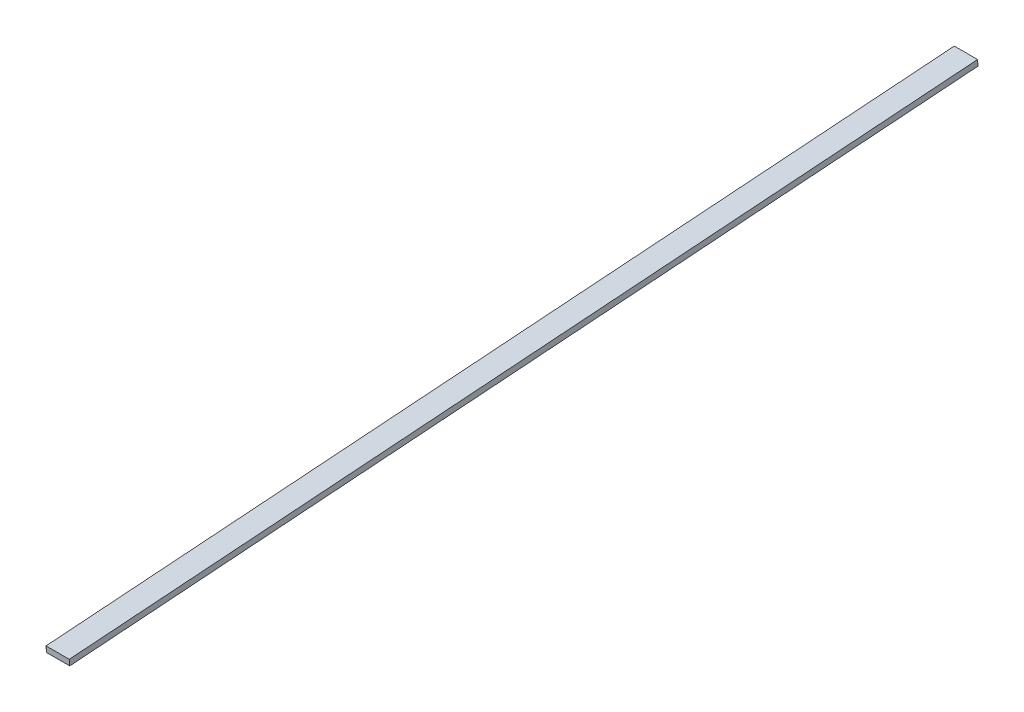
ISO-10303-21;
HEADER;
FILE_DESCRIPTION(('STEP AP214'),'2;1');
FILE_NAME('part.step','',(''),(''),'','','');
FILE_SCHEMA(('AUTOMOTIVE_DESIGN { 1 0 10303 214 1 1 1 1 }'));
ENDSEC;
DATA;
#1=APPLICATION_CONTEXT('core data for automotive mechanical design processes');
#2=APPLICATION_PROTOCOL_DEFINITION('international standard','automotive_design',2000,#1);
#3=PRODUCT_CONTEXT('',#1,'mechanical');
#4=PRODUCT('Part','Part','',(#3));
#5=PRODUCT_RELATED_PRODUCT_CATEGORY('part','',(#4));
#6=PRODUCT_DEFINITION_FORMATION('','',#4);
#7=PRODUCT_DEFINITION_CONTEXT('part definition',#1,'design');
#8=PRODUCT_DEFINITION('design','',#6,#7);
#9=PRODUCT_DEFINITION_SHAPE('','',#8);
#10=(LENGTH_UNIT() NAMED_UNIT(*) SI_UNIT(.MILLI.,.METRE.));
#11=(NAMED_UNIT(*) PLANE_ANGLE_UNIT() SI_UNIT($,.RADIAN.));
#12=(NAMED_UNIT(*) SI_UNIT($,.STERADIAN.) SOLID_ANGLE_UNIT());
#13=UNCERTAINTY_MEASURE_WITH_UNIT(LENGTH_MEASURE(1.E-05),#10,'distance_accuracy_value','');
#14=(GEOMETRIC_REPRESENTATION_CONTEXT(3) GLOBAL_UNCERTAINTY_ASSIGNED_CONTEXT((#13)) GLOBAL_UNIT_ASSIGNED_CONTEXT((#10,
#11,#12)) REPRESENTATION_CONTEXT('',''));
#15=CARTESIAN_POINT('',(0.,0.,0.));
#16=DIRECTION('',(0.,0.,1.));
#17=DIRECTION('',(1.,0.,0.));
#18=AXIS2_PLACEMENT_3D('',#15,#16,#17);
#19=CARTESIAN_POINT('',(238.509206630726,-2.28315338320972E-13,3.17570620364431E-12));
#20=DIRECTION('',(-1.,0.,0.));
#21=DIRECTION('',(0.,0.,1.));
#22=AXIS2_PLACEMENT_3D('',#19,#20,#21);
#23=PLANE('',#22);
#24=DIRECTION('',(0.,0.997425576822391,0.0717092650953869));
#25=VECTOR('',#24,1.);
#26=CARTESIAN_POINT('',(238.509206630716,424.560737078755,777.222709452929));
#27=LINE('',#26,#25);
#28=CARTESIAN_POINT('',(238.509206630716,419.810497769102,776.88119407791));
#29=VERTEX_POINT('',#28);
#30=CARTESIAN_POINT('',(238.509206630716,424.560737078755,777.222709452929));
#31=VERTEX_POINT('',#30);
#32=EDGE_CURVE('E76',#29,#31,#27,.T.);
#33=ORIENTED_EDGE('',*,*,#32,.F.);
#34=DIRECTION('',(0.,0.0717092650953895,-0.997425576822391));
#35=VECTOR('',#34,1.);
#36=CARTESIAN_POINT('',(238.509206630707,367.994441226327,1497.60619407791));
#37=LINE('',#36,#35);
#38=CARTESIAN_POINT('',(238.509206630707,367.766176660059,1500.78119407791));
#39=VERTEX_POINT('',#38);
#40=EDGE_CURVE('E81',#39,#29,#37,.T.);
#41=ORIENTED_EDGE('',*,*,#40,.F.);
#42=DIRECTION('',(0.,-0.997425576822391,-0.0717092650953928));
#43=VECTOR('',#42,1.);
#44=CARTESIAN_POINT('',(238.509206630707,367.766176660059,1500.78119407791));
#45=LINE('',#44,#43);
#46=CARTESIAN_POINT('',(238.509206630707,372.516415969676,1501.12270945293));
#47=VERTEX_POINT('',#46);
#48=EDGE_CURVE('E88',#47,#39,#45,.T.);
#49=ORIENTED_EDGE('',*,*,#48,.F.);
#50=DIRECTION('',(0.,-0.0717092650953896,0.997425576822391));
#51=VECTOR('',#50,1.);
#52=CARTESIAN_POINT('',(238.509206630707,372.516415969676,1501.12270945293));
#53=LINE('',#52,#51);
#54=EDGE_CURVE('E91',#31,#47,#53,.T.);
#55=ORIENTED_EDGE('',*,*,#54,.F.);
#56=EDGE_LOOP('',(#33,#41,#49,#55));
#57=FACE_BOUND('',#56,.T.);
#58=ADVANCED_FACE('F33',(#57),#23,.T.);
#59=CARTESIAN_POINT('',(983.516205571364,367.994441226327,1497.60619407792));
#60=DIRECTION('',(0.,0.997425576822391,0.0717092650953895));
#61=DIRECTION('',(0.,-0.0717092650953895,0.997425576822391));
#62=AXIS2_PLACEMENT_3D('',#59,#60,#61);
#63=PLANE('',#62);
#64=DIRECTION('',(-1.,0.,0.));
#65=VECTOR('',#64,1.);
#66=CARTESIAN_POINT('',(983.516205571374,419.810497769102,776.88119407792));
#67=LINE('',#66,#65);
#68=CARTESIAN_POINT('',(257.051206630713,419.810497769138,776.88119407791));
#69=VERTEX_POINT('',#68);
#70=EDGE_CURVE('E72',#69,#29,#67,.T.);
#71=ORIENTED_EDGE('',*,*,#70,.F.);
#72=DIRECTION('',(0.,-0.0717092650953895,0.997425576822391));
#73=VECTOR('',#72,1.);
#74=CARTESIAN_POINT('',(257.051206630704,367.994441226327,1497.60619407791));
#75=LINE('',#74,#73);
#76=CARTESIAN_POINT('',(257.051206630709,367.766176660059,1500.78119407791));
#77=VERTEX_POINT('',#76);
#78=EDGE_CURVE('E37',#69,#77,#75,.T.);
#79=ORIENTED_EDGE('',*,*,#78,.T.);
#80=DIRECTION('',(-1.,0.,0.));
#81=VECTOR('',#80,1.);
#82=CARTESIAN_POINT('',(983.516205571364,367.766176660059,1500.78119407792));
#83=LINE('',#82,#81);
#84=EDGE_CURVE('E84',#77,#39,#83,.T.);
#85=ORIENTED_EDGE('',*,*,#84,.T.);
#86=ORIENTED_EDGE('',*,*,#40,.T.);
#87=EDGE_LOOP('',(#71,#79,#85,#86));
#88=FACE_BOUND('',#87,.T.);
#89=ADVANCED_FACE('F82',(#88),#63,.F.);
#90=CARTESIAN_POINT('',(983.516205571364,367.766176660059,1500.78119407792));
#91=DIRECTION('',(0.,0.0717092650953929,-0.997425576822391));
#92=DIRECTION('',(0.,0.997425576822391,0.0717092650953929));
#93=AXIS2_PLACEMENT_3D('',#90,#91,#92);
#94=PLANE('',#93);
#95=ORIENTED_EDGE('',*,*,#84,.F.);
#96=DIRECTION('',(0.,0.997425576822391,0.0717092650953929));
#97=VECTOR('',#96,1.);
#98=CARTESIAN_POINT('',(257.051206630704,367.766176660059,1500.78119407791));
#99=LINE('',#98,#97);
#100=CARTESIAN_POINT('',(257.051206630704,372.516415969676,1501.12270945293));
#101=VERTEX_POINT('',#100);
#102=EDGE_CURVE('E103',#77,#101,#99,.T.);
#103=ORIENTED_EDGE('',*,*,#102,.T.);
#104=DIRECTION('',(-1.,0.,0.));
#105=VECTOR('',#104,1.);
#106=CARTESIAN_POINT('',(983.516205571364,372.516415969676,1501.12270945294));
#107=LINE('',#106,#105);
#108=EDGE_CURVE('E98',#101,#47,#107,.T.);
#109=ORIENTED_EDGE('',*,*,#108,.T.);
#110=ORIENTED_EDGE('',*,*,#48,.T.);
#111=EDGE_LOOP('',(#95,#103,#109,#110));
#112=FACE_BOUND('',#111,.T.);
#113=ADVANCED_FACE('F106',(#112),#94,.F.);
#114=CARTESIAN_POINT('',(983.516205571364,372.516415969676,1501.12270945294));
#115=DIRECTION('',(0.,-0.997425576822391,-0.0717092650953896));
#116=DIRECTION('',(0.,0.0717092650953896,-0.997425576822391));
#117=AXIS2_PLACEMENT_3D('',#114,#115,#116);
#118=PLANE('',#117);
#119=ORIENTED_EDGE('',*,*,#108,.F.);
#120=DIRECTION('',(0.,0.0717092650953896,-0.997425576822391));
#121=VECTOR('',#120,1.);
#122=CARTESIAN_POINT('',(257.051206630704,372.516415969676,1501.12270945293));
#123=LINE('',#122,#121);
#124=CARTESIAN_POINT('',(257.051206630713,424.560737078755,777.222709452929));
#125=VERTEX_POINT('',#124);
#126=EDGE_CURVE('E42',#101,#125,#123,.T.);
#127=ORIENTED_EDGE('',*,*,#126,.T.);
#128=DIRECTION('',(-1.,0.,0.));
#129=VECTOR('',#128,1.);
#130=CARTESIAN_POINT('',(983.516205571374,424.560737078755,777.222709452939));
#131=LINE('',#130,#129);
#132=EDGE_CURVE('E79',#125,#31,#131,.T.);
#133=ORIENTED_EDGE('',*,*,#132,.T.);
#134=ORIENTED_EDGE('',*,*,#54,.T.);
#135=EDGE_LOOP('',(#119,#127,#133,#134));
#136=FACE_BOUND('',#135,.T.);
#137=ADVANCED_FACE('F101',(#136),#118,.F.);
#138=CARTESIAN_POINT('',(983.516205571374,424.560737078755,777.222709452939));
#139=DIRECTION('',(0.,-0.0717092650953869,0.997425576822391));
#140=DIRECTION('',(0.,-0.997425576822391,-0.0717092650953869));
#141=AXIS2_PLACEMENT_3D('',#138,#139,#140);
#142=PLANE('',#141);
#143=ORIENTED_EDGE('',*,*,#132,.F.);
#144=DIRECTION('',(0.,-0.997425576822391,-0.0717092650953869));
#145=VECTOR('',#144,1.);
#146=CARTESIAN_POINT('',(257.051206630713,424.560737078755,777.222709452929));
#147=LINE('',#146,#145);
#148=EDGE_CURVE('E11',#125,#69,#147,.T.);
#149=ORIENTED_EDGE('',*,*,#148,.T.);
#150=ORIENTED_EDGE('',*,*,#70,.T.);
#151=ORIENTED_EDGE('',*,*,#32,.T.);
#152=EDGE_LOOP('',(#143,#149,#150,#151));
#153=FACE_BOUND('',#152,.T.);
#154=ADVANCED_FACE('F35',(#153),#142,.F.);
#155=CARTESIAN_POINT('',(257.051206630713,344.834338896103,776.881194077912));
#156=DIRECTION('',(-1.,0.,0.));
#157=DIRECTION('',(0.,0.,1.));
#158=AXIS2_PLACEMENT_3D('',#155,#156,#157);
#159=PLANE('',#158);
#160=ORIENTED_EDGE('',*,*,#126,.F.);
#161=ORIENTED_EDGE('',*,*,#102,.F.);
#162=ORIENTED_EDGE('',*,*,#78,.F.);
#163=ORIENTED_EDGE('',*,*,#148,.F.);
#164=EDGE_LOOP('',(#160,#161,#162,#163));
#165=FACE_BOUND('',#164,.T.);
#166=ADVANCED_FACE('F107',(#165),#159,.F.);
#167=CLOSED_SHELL('',(#58,#89,#113,#137,#154,#166));
#168=MANIFOLD_SOLID_BREP('B2',#167);
#169=ADVANCED_BREP_SHAPE_REPRESENTATION('',(#18,#168),#14);
#170=SHAPE_DEFINITION_REPRESENTATION(#9,#169);
ENDSEC;
END-ISO-10303-21;
